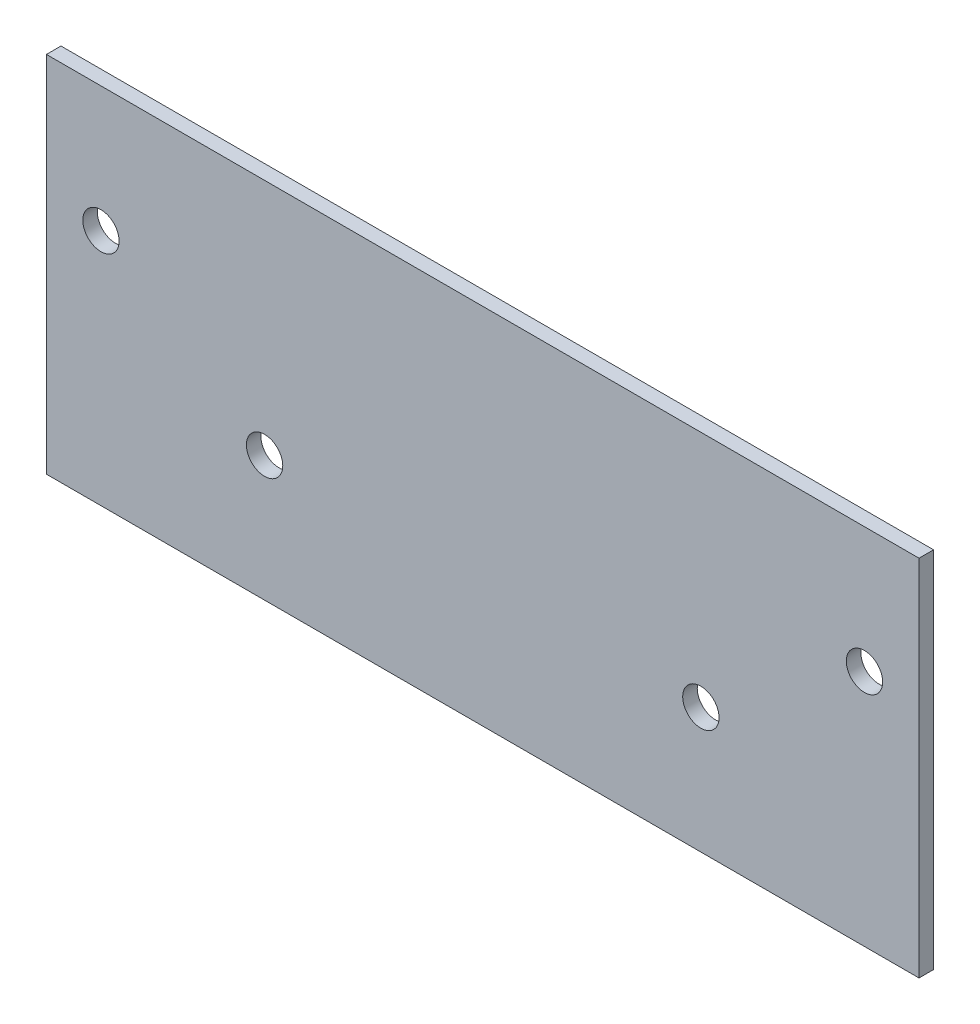
ISO-10303-21;
HEADER;
FILE_DESCRIPTION(('STEP AP214'),'2;1');
FILE_NAME('part.step','',(''),(''),'','','');
FILE_SCHEMA(('AUTOMOTIVE_DESIGN { 1 0 10303 214 1 1 1 1 }'));
ENDSEC;
DATA;
#1=APPLICATION_CONTEXT('core data for automotive mechanical design processes');
#2=APPLICATION_PROTOCOL_DEFINITION('international standard','automotive_design',2000,#1);
#3=PRODUCT_CONTEXT('',#1,'mechanical');
#4=PRODUCT('Part','Part','',(#3));
#5=PRODUCT_RELATED_PRODUCT_CATEGORY('part','',(#4));
#6=PRODUCT_DEFINITION_FORMATION('','',#4);
#7=PRODUCT_DEFINITION_CONTEXT('part definition',#1,'design');
#8=PRODUCT_DEFINITION('design','',#6,#7);
#9=PRODUCT_DEFINITION_SHAPE('','',#8);
#10=(LENGTH_UNIT() NAMED_UNIT(*) SI_UNIT(.MILLI.,.METRE.));
#11=(NAMED_UNIT(*) PLANE_ANGLE_UNIT() SI_UNIT($,.RADIAN.));
#12=(NAMED_UNIT(*) SI_UNIT($,.STERADIAN.) SOLID_ANGLE_UNIT());
#13=UNCERTAINTY_MEASURE_WITH_UNIT(LENGTH_MEASURE(1.E-05),#10,'distance_accuracy_value','');
#14=(GEOMETRIC_REPRESENTATION_CONTEXT(3) GLOBAL_UNCERTAINTY_ASSIGNED_CONTEXT((#13)) GLOBAL_UNIT_ASSIGNED_CONTEXT((#10,
#11,#12)) REPRESENTATION_CONTEXT('',''));
#15=CARTESIAN_POINT('',(0.,0.,0.));
#16=DIRECTION('',(0.,0.,1.));
#17=DIRECTION('',(1.,0.,0.));
#18=AXIS2_PLACEMENT_3D('',#15,#16,#17);
#19=CARTESIAN_POINT('',(0.,0.,2.));
#20=DIRECTION('',(0.,0.,1.));
#21=DIRECTION('',(1.,0.,0.));
#22=AXIS2_PLACEMENT_3D('',#19,#20,#21);
#23=PLANE('',#22);
#24=CARTESIAN_POINT('',(52.5,7.75,2.));
#25=DIRECTION('',(0.,0.,1.));
#26=DIRECTION('',(-1.,0.,0.));
#27=AXIS2_PLACEMENT_3D('',#24,#25,#26);
#28=CIRCLE('',#27,2.5);
#29=CARTESIAN_POINT('',(50.,7.75,2.));
#30=VERTEX_POINT('',#29);
#31=EDGE_CURVE('E144',#30,#30,#28,.T.);
#32=ORIENTED_EDGE('',*,*,#31,.F.);
#33=EDGE_LOOP('',(#32));
#34=FACE_BOUND('',#33,.T.);
#35=CARTESIAN_POINT('',(-52.5,7.75,2.));
#36=DIRECTION('',(0.,0.,1.));
#37=DIRECTION('',(1.,0.,0.));
#38=AXIS2_PLACEMENT_3D('',#35,#36,#37);
#39=CIRCLE('',#38,2.5);
#40=CARTESIAN_POINT('',(-50.,7.75,2.));
#41=VERTEX_POINT('',#40);
#42=EDGE_CURVE('E114',#41,#41,#39,.T.);
#43=ORIENTED_EDGE('',*,*,#42,.F.);
#44=EDGE_LOOP('',(#43));
#45=FACE_BOUND('',#44,.T.);
#46=DIRECTION('',(0.,-1.,0.));
#47=VECTOR('',#46,1.);
#48=CARTESIAN_POINT('',(-60.,25.,2.));
#49=LINE('',#48,#47);
#50=CARTESIAN_POINT('',(-60.,25.,2.));
#51=VERTEX_POINT('',#50);
#52=CARTESIAN_POINT('',(-60.,-25.,2.));
#53=VERTEX_POINT('',#52);
#54=EDGE_CURVE('E94',#51,#53,#49,.T.);
#55=ORIENTED_EDGE('',*,*,#54,.T.);
#56=DIRECTION('',(1.,0.,0.));
#57=VECTOR('',#56,1.);
#58=CARTESIAN_POINT('',(-60.,-25.,2.));
#59=LINE('',#58,#57);
#60=CARTESIAN_POINT('',(60.,-25.,2.));
#61=VERTEX_POINT('',#60);
#62=EDGE_CURVE('E89',#53,#61,#59,.T.);
#63=ORIENTED_EDGE('',*,*,#62,.T.);
#64=DIRECTION('',(0.,1.,0.));
#65=VECTOR('',#64,1.);
#66=CARTESIAN_POINT('',(60.,25.,2.));
#67=LINE('',#66,#65);
#68=CARTESIAN_POINT('',(60.,25.,2.));
#69=VERTEX_POINT('',#68);
#70=EDGE_CURVE('E92',#61,#69,#67,.T.);
#71=ORIENTED_EDGE('',*,*,#70,.T.);
#72=DIRECTION('',(-1.,0.,0.));
#73=VECTOR('',#72,1.);
#74=CARTESIAN_POINT('',(-60.,25.,2.));
#75=LINE('',#74,#73);
#76=EDGE_CURVE('E59',#69,#51,#75,.T.);
#77=ORIENTED_EDGE('',*,*,#76,.T.);
#78=EDGE_LOOP('',(#55,#63,#71,#77));
#79=FACE_BOUND('',#78,.T.);
#80=CARTESIAN_POINT('',(30.,-7.75,2.));
#81=DIRECTION('',(0.,0.,1.));
#82=DIRECTION('',(-1.,0.,0.));
#83=AXIS2_PLACEMENT_3D('',#80,#81,#82);
#84=CIRCLE('',#83,2.5);
#85=CARTESIAN_POINT('',(27.5,-7.75,2.));
#86=VERTEX_POINT('',#85);
#87=EDGE_CURVE('E136',#86,#86,#84,.T.);
#88=ORIENTED_EDGE('',*,*,#87,.F.);
#89=EDGE_LOOP('',(#88));
#90=FACE_BOUND('',#89,.T.);
#91=CARTESIAN_POINT('',(-30.,-7.75,2.));
#92=DIRECTION('',(0.,0.,1.));
#93=DIRECTION('',(1.,0.,0.));
#94=AXIS2_PLACEMENT_3D('',#91,#92,#93);
#95=CIRCLE('',#94,2.5);
#96=CARTESIAN_POINT('',(-27.5,-7.75,2.));
#97=VERTEX_POINT('',#96);
#98=EDGE_CURVE('E152',#97,#97,#95,.T.);
#99=ORIENTED_EDGE('',*,*,#98,.F.);
#100=EDGE_LOOP('',(#99));
#101=FACE_BOUND('',#100,.T.);
#102=ADVANCED_FACE('F41',(#34,#45,#79,#90,#101),#23,.T.);
#103=CARTESIAN_POINT('',(0.,0.,0.));
#104=DIRECTION('',(0.,0.,1.));
#105=DIRECTION('',(1.,0.,0.));
#106=AXIS2_PLACEMENT_3D('',#103,#104,#105);
#107=PLANE('',#106);
#108=DIRECTION('',(0.,-1.,0.));
#109=VECTOR('',#108,1.);
#110=CARTESIAN_POINT('',(-60.,25.,0.));
#111=LINE('',#110,#109);
#112=CARTESIAN_POINT('',(-60.,25.,0.));
#113=VERTEX_POINT('',#112);
#114=CARTESIAN_POINT('',(-60.,-25.,0.));
#115=VERTEX_POINT('',#114);
#116=EDGE_CURVE('E110',#113,#115,#111,.T.);
#117=ORIENTED_EDGE('',*,*,#116,.F.);
#118=DIRECTION('',(-1.,0.,0.));
#119=VECTOR('',#118,1.);
#120=CARTESIAN_POINT('',(-60.,25.,0.));
#121=LINE('',#120,#119);
#122=CARTESIAN_POINT('',(60.,25.,0.));
#123=VERTEX_POINT('',#122);
#124=EDGE_CURVE('E82',#123,#113,#121,.T.);
#125=ORIENTED_EDGE('',*,*,#124,.F.);
#126=DIRECTION('',(0.,1.,0.));
#127=VECTOR('',#126,1.);
#128=CARTESIAN_POINT('',(60.,25.,0.));
#129=LINE('',#128,#127);
#130=CARTESIAN_POINT('',(60.,-25.,0.));
#131=VERTEX_POINT('',#130);
#132=EDGE_CURVE('E76',#131,#123,#129,.T.);
#133=ORIENTED_EDGE('',*,*,#132,.F.);
#134=DIRECTION('',(1.,0.,0.));
#135=VECTOR('',#134,1.);
#136=CARTESIAN_POINT('',(-60.,-25.,0.));
#137=LINE('',#136,#135);
#138=EDGE_CURVE('E99',#115,#131,#137,.T.);
#139=ORIENTED_EDGE('',*,*,#138,.F.);
#140=EDGE_LOOP('',(#117,#125,#133,#139));
#141=FACE_BOUND('',#140,.T.);
#142=CARTESIAN_POINT('',(-52.5,7.75,0.));
#143=DIRECTION('',(0.,0.,1.));
#144=DIRECTION('',(1.,0.,0.));
#145=AXIS2_PLACEMENT_3D('',#142,#143,#144);
#146=CIRCLE('',#145,2.5);
#147=CARTESIAN_POINT('',(-50.,7.75,0.));
#148=VERTEX_POINT('',#147);
#149=EDGE_CURVE('E132',#148,#148,#146,.T.);
#150=ORIENTED_EDGE('',*,*,#149,.T.);
#151=EDGE_LOOP('',(#150));
#152=FACE_BOUND('',#151,.T.);
#153=CARTESIAN_POINT('',(30.,-7.75,0.));
#154=DIRECTION('',(0.,0.,1.));
#155=DIRECTION('',(-1.,0.,0.));
#156=AXIS2_PLACEMENT_3D('',#153,#154,#155);
#157=CIRCLE('',#156,2.5);
#158=CARTESIAN_POINT('',(27.5,-7.75,0.));
#159=VERTEX_POINT('',#158);
#160=EDGE_CURVE('E140',#159,#159,#157,.T.);
#161=ORIENTED_EDGE('',*,*,#160,.T.);
#162=EDGE_LOOP('',(#161));
#163=FACE_BOUND('',#162,.T.);
#164=CARTESIAN_POINT('',(52.5,7.75,0.));
#165=DIRECTION('',(0.,0.,1.));
#166=DIRECTION('',(-1.,0.,0.));
#167=AXIS2_PLACEMENT_3D('',#164,#165,#166);
#168=CIRCLE('',#167,2.5);
#169=CARTESIAN_POINT('',(50.,7.75,0.));
#170=VERTEX_POINT('',#169);
#171=EDGE_CURVE('E148',#170,#170,#168,.T.);
#172=ORIENTED_EDGE('',*,*,#171,.T.);
#173=EDGE_LOOP('',(#172));
#174=FACE_BOUND('',#173,.T.);
#175=CARTESIAN_POINT('',(-30.,-7.75,0.));
#176=DIRECTION('',(0.,0.,1.));
#177=DIRECTION('',(1.,0.,0.));
#178=AXIS2_PLACEMENT_3D('',#175,#176,#177);
#179=CIRCLE('',#178,2.5);
#180=CARTESIAN_POINT('',(-27.5,-7.75,0.));
#181=VERTEX_POINT('',#180);
#182=EDGE_CURVE('E156',#181,#181,#179,.T.);
#183=ORIENTED_EDGE('',*,*,#182,.T.);
#184=EDGE_LOOP('',(#183));
#185=FACE_BOUND('',#184,.T.);
#186=ADVANCED_FACE('F127',(#141,#152,#163,#174,#185),#107,.F.);
#187=CARTESIAN_POINT('',(-60.,25.,2.));
#188=DIRECTION('',(1.,0.,0.));
#189=DIRECTION('',(0.,1.,0.));
#190=AXIS2_PLACEMENT_3D('',#187,#188,#189);
#191=PLANE('',#190);
#192=ORIENTED_EDGE('',*,*,#116,.T.);
#193=DIRECTION('',(0.,0.,-1.));
#194=VECTOR('',#193,1.);
#195=CARTESIAN_POINT('',(-60.,-25.,2.));
#196=LINE('',#195,#194);
#197=EDGE_CURVE('E11',#53,#115,#196,.T.);
#198=ORIENTED_EDGE('',*,*,#197,.F.);
#199=ORIENTED_EDGE('',*,*,#54,.F.);
#200=DIRECTION('',(0.,0.,-1.));
#201=VECTOR('',#200,1.);
#202=CARTESIAN_POINT('',(-60.,25.,2.));
#203=LINE('',#202,#201);
#204=EDGE_CURVE('E106',#51,#113,#203,.T.);
#205=ORIENTED_EDGE('',*,*,#204,.T.);
#206=EDGE_LOOP('',(#192,#198,#199,#205));
#207=FACE_BOUND('',#206,.T.);
#208=ADVANCED_FACE('F43',(#207),#191,.F.);
#209=CARTESIAN_POINT('',(-60.,-25.,2.));
#210=DIRECTION('',(0.,1.,0.));
#211=DIRECTION('',(0.,0.,1.));
#212=AXIS2_PLACEMENT_3D('',#209,#210,#211);
#213=PLANE('',#212);
#214=ORIENTED_EDGE('',*,*,#138,.T.);
#215=DIRECTION('',(0.,0.,-1.));
#216=VECTOR('',#215,1.);
#217=CARTESIAN_POINT('',(60.,-25.,2.));
#218=LINE('',#217,#216);
#219=EDGE_CURVE('E51',#61,#131,#218,.T.);
#220=ORIENTED_EDGE('',*,*,#219,.F.);
#221=ORIENTED_EDGE('',*,*,#62,.F.);
#222=ORIENTED_EDGE('',*,*,#197,.T.);
#223=EDGE_LOOP('',(#214,#220,#221,#222));
#224=FACE_BOUND('',#223,.T.);
#225=ADVANCED_FACE('F98',(#224),#213,.F.);
#226=CARTESIAN_POINT('',(60.,25.,2.));
#227=DIRECTION('',(-1.,0.,0.));
#228=DIRECTION('',(0.,-1.,0.));
#229=AXIS2_PLACEMENT_3D('',#226,#227,#228);
#230=PLANE('',#229);
#231=ORIENTED_EDGE('',*,*,#132,.T.);
#232=DIRECTION('',(0.,0.,-1.));
#233=VECTOR('',#232,1.);
#234=CARTESIAN_POINT('',(60.,25.,2.));
#235=LINE('',#234,#233);
#236=EDGE_CURVE('E101',#69,#123,#235,.T.);
#237=ORIENTED_EDGE('',*,*,#236,.F.);
#238=ORIENTED_EDGE('',*,*,#70,.F.);
#239=ORIENTED_EDGE('',*,*,#219,.T.);
#240=EDGE_LOOP('',(#231,#237,#238,#239));
#241=FACE_BOUND('',#240,.T.);
#242=ADVANCED_FACE('F102',(#241),#230,.F.);
#243=CARTESIAN_POINT('',(-60.,25.,2.));
#244=DIRECTION('',(0.,-1.,0.));
#245=DIRECTION('',(0.,0.,-1.));
#246=AXIS2_PLACEMENT_3D('',#243,#244,#245);
#247=PLANE('',#246);
#248=ORIENTED_EDGE('',*,*,#124,.T.);
#249=ORIENTED_EDGE('',*,*,#204,.F.);
#250=ORIENTED_EDGE('',*,*,#76,.F.);
#251=ORIENTED_EDGE('',*,*,#236,.T.);
#252=EDGE_LOOP('',(#248,#249,#250,#251));
#253=FACE_BOUND('',#252,.T.);
#254=ADVANCED_FACE('F124',(#253),#247,.F.);
#255=CARTESIAN_POINT('',(-52.5,7.75,2.));
#256=DIRECTION('',(0.,0.,-1.));
#257=DIRECTION('',(-1.,0.,0.));
#258=AXIS2_PLACEMENT_3D('',#255,#256,#257);
#259=CYLINDRICAL_SURFACE('',#258,2.5);
#260=ORIENTED_EDGE('',*,*,#42,.T.);
#261=EDGE_LOOP('',(#260));
#262=FACE_BOUND('',#261,.T.);
#263=ORIENTED_EDGE('',*,*,#149,.F.);
#264=EDGE_LOOP('',(#263));
#265=FACE_BOUND('',#264,.T.);
#266=ADVANCED_FACE('F177',(#262,#265),#259,.F.);
#267=CARTESIAN_POINT('',(30.,-7.75,2.));
#268=DIRECTION('',(0.,0.,-1.));
#269=DIRECTION('',(-1.,0.,0.));
#270=AXIS2_PLACEMENT_3D('',#267,#268,#269);
#271=CYLINDRICAL_SURFACE('',#270,2.5);
#272=ORIENTED_EDGE('',*,*,#87,.T.);
#273=EDGE_LOOP('',(#272));
#274=FACE_BOUND('',#273,.T.);
#275=ORIENTED_EDGE('',*,*,#160,.F.);
#276=EDGE_LOOP('',(#275));
#277=FACE_BOUND('',#276,.T.);
#278=ADVANCED_FACE('F223',(#274,#277),#271,.F.);
#279=CARTESIAN_POINT('',(52.5,7.75,2.));
#280=DIRECTION('',(0.,0.,-1.));
#281=DIRECTION('',(-1.,0.,0.));
#282=AXIS2_PLACEMENT_3D('',#279,#280,#281);
#283=CYLINDRICAL_SURFACE('',#282,2.5);
#284=ORIENTED_EDGE('',*,*,#31,.T.);
#285=EDGE_LOOP('',(#284));
#286=FACE_BOUND('',#285,.T.);
#287=ORIENTED_EDGE('',*,*,#171,.F.);
#288=EDGE_LOOP('',(#287));
#289=FACE_BOUND('',#288,.T.);
#290=ADVANCED_FACE('F231',(#286,#289),#283,.F.);
#291=CARTESIAN_POINT('',(-30.,-7.75,2.));
#292=DIRECTION('',(0.,0.,-1.));
#293=DIRECTION('',(-1.,0.,0.));
#294=AXIS2_PLACEMENT_3D('',#291,#292,#293);
#295=CYLINDRICAL_SURFACE('',#294,2.5);
#296=ORIENTED_EDGE('',*,*,#98,.T.);
#297=EDGE_LOOP('',(#296));
#298=FACE_BOUND('',#297,.T.);
#299=ORIENTED_EDGE('',*,*,#182,.F.);
#300=EDGE_LOOP('',(#299));
#301=FACE_BOUND('',#300,.T.);
#302=ADVANCED_FACE('F164',(#298,#301),#295,.F.);
#303=CLOSED_SHELL('',(#102,#186,#208,#225,#242,#254,#266,#278,#290,#302));
#304=MANIFOLD_SOLID_BREP('B2',#303);
#305=ADVANCED_BREP_SHAPE_REPRESENTATION('',(#18,#304),#14);
#306=SHAPE_DEFINITION_REPRESENTATION(#9,#305);
ENDSEC;
END-ISO-10303-21;
